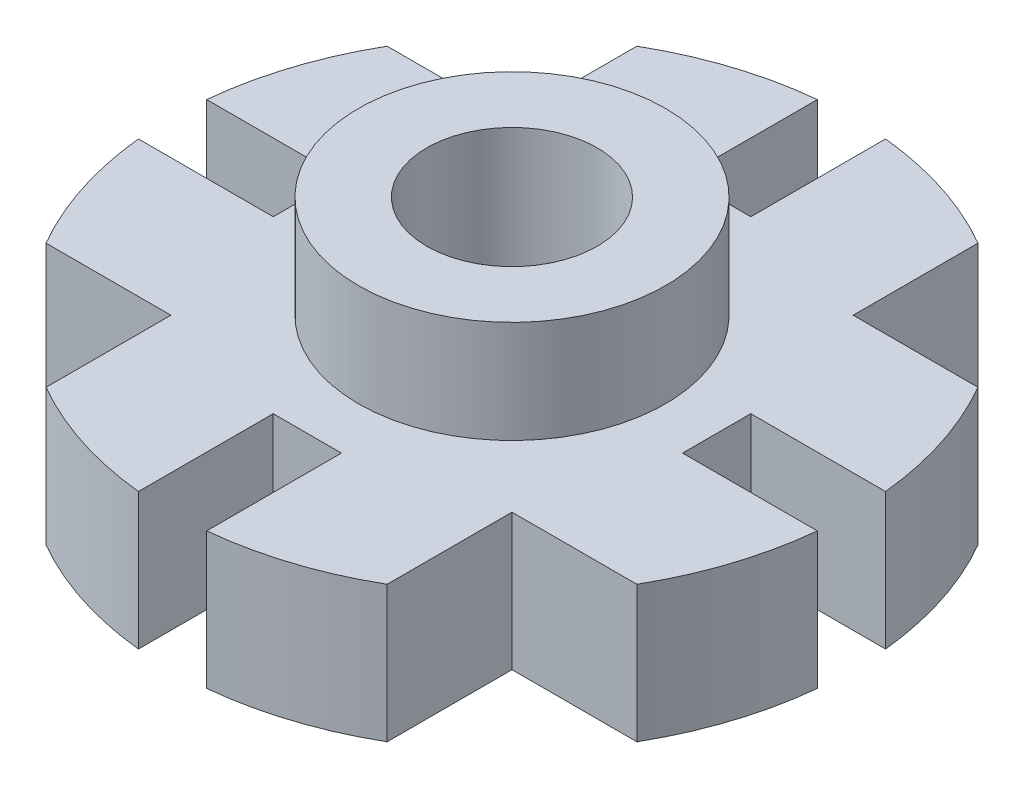
ISO-10303-21;
HEADER;
FILE_DESCRIPTION(('STEP AP214'),'2;1');
FILE_NAME('part.step','',(''),(''),'','','');
FILE_SCHEMA(('AUTOMOTIVE_DESIGN { 1 0 10303 214 1 1 1 1 }'));
ENDSEC;
DATA;
#1=APPLICATION_CONTEXT('core data for automotive mechanical design processes');
#2=APPLICATION_PROTOCOL_DEFINITION('international standard','automotive_design',2000,#1);
#3=PRODUCT_CONTEXT('',#1,'mechanical');
#4=PRODUCT('Part','Part','',(#3));
#5=PRODUCT_RELATED_PRODUCT_CATEGORY('part','',(#4));
#6=PRODUCT_DEFINITION_FORMATION('','',#4);
#7=PRODUCT_DEFINITION_CONTEXT('part definition',#1,'design');
#8=PRODUCT_DEFINITION('design','',#6,#7);
#9=PRODUCT_DEFINITION_SHAPE('','',#8);
#10=(LENGTH_UNIT() NAMED_UNIT(*) SI_UNIT(.MILLI.,.METRE.));
#11=(NAMED_UNIT(*) PLANE_ANGLE_UNIT() SI_UNIT($,.RADIAN.));
#12=(NAMED_UNIT(*) SI_UNIT($,.STERADIAN.) SOLID_ANGLE_UNIT());
#13=UNCERTAINTY_MEASURE_WITH_UNIT(LENGTH_MEASURE(1.E-05),#10,'distance_accuracy_value','');
#14=(GEOMETRIC_REPRESENTATION_CONTEXT(3) GLOBAL_UNCERTAINTY_ASSIGNED_CONTEXT((#13)) GLOBAL_UNIT_ASSIGNED_CONTEXT((#10,
#11,#12)) REPRESENTATION_CONTEXT('',''));
#15=CARTESIAN_POINT('',(0.,0.,0.));
#16=DIRECTION('',(0.,0.,1.));
#17=DIRECTION('',(1.,0.,0.));
#18=AXIS2_PLACEMENT_3D('',#15,#16,#17);
#19=CARTESIAN_POINT('',(20.7089403725581,25.4,-32.941168467633));
#20=DIRECTION('',(0.,-1.,0.));
#21=DIRECTION('',(0.,0.,-1.));
#22=AXIS2_PLACEMENT_3D('',#19,#20,#21);
#23=CYLINDRICAL_SURFACE('',#22,63.5);
#24=CARTESIAN_POINT('',(20.7089403725581,25.4,-32.941168467633));
#25=DIRECTION('',(0.,1.,0.));
#26=DIRECTION('',(0.,0.,1.));
#27=AXIS2_PLACEMENT_3D('',#24,#25,#26);
#28=CIRCLE('',#27,63.5);
#29=CARTESIAN_POINT('',(52.4589403725581,25.4,-87.9337816079449));
#30=VERTEX_POINT('',#29);
#31=CARTESIAN_POINT('',(27.0589403725581,25.4,-96.1228707239034));
#32=VERTEX_POINT('',#31);
#33=EDGE_CURVE('E509',#30,#32,#28,.T.);
#34=ORIENTED_EDGE('',*,*,#33,.F.);
#35=DIRECTION('',(0.,-1.,0.));
#36=VECTOR('',#35,1.);
#37=CARTESIAN_POINT('',(52.4589403725581,25.4,-87.9337816079449));
#38=LINE('',#37,#36);
#39=CARTESIAN_POINT('',(52.4589403725581,0.,-87.9337816079449));
#40=VERTEX_POINT('',#39);
#41=EDGE_CURVE('E321',#30,#40,#38,.T.);
#42=ORIENTED_EDGE('',*,*,#41,.T.);
#43=CARTESIAN_POINT('',(20.7089403725581,0.,-32.941168467633));
#44=DIRECTION('',(0.,1.,0.));
#45=DIRECTION('',(0.,0.,1.));
#46=AXIS2_PLACEMENT_3D('',#43,#44,#45);
#47=CIRCLE('',#46,63.5);
#48=CARTESIAN_POINT('',(27.0589403725581,0.,-96.1228707239034));
#49=VERTEX_POINT('',#48);
#50=EDGE_CURVE('E479',#40,#49,#47,.T.);
#51=ORIENTED_EDGE('',*,*,#50,.T.);
#52=DIRECTION('',(0.,1.,0.));
#53=VECTOR('',#52,1.);
#54=CARTESIAN_POINT('',(27.0589403725581,0.,-96.1228707239034));
#55=LINE('',#54,#53);
#56=EDGE_CURVE('E344',#49,#32,#55,.T.);
#57=ORIENTED_EDGE('',*,*,#56,.T.);
#58=EDGE_LOOP('',(#34,#42,#51,#57));
#59=FACE_BOUND('',#58,.T.);
#60=ADVANCED_FACE('F39',(#59),#23,.T.);
#61=CARTESIAN_POINT('',(14.3589403725581,0.,-96.1228707239034));
#62=VERTEX_POINT('',#61);
#63=CARTESIAN_POINT('',(-11.0410596274419,0.,-87.9337816079449));
#64=VERTEX_POINT('',#63);
#65=EDGE_CURVE('E556',#62,#64,#47,.T.);
#66=ORIENTED_EDGE('',*,*,#65,.T.);
#67=DIRECTION('',(0.,-1.,0.));
#68=VECTOR('',#67,1.);
#69=CARTESIAN_POINT('',(-11.0410596274419,25.4,-87.9337816079449));
#70=LINE('',#69,#68);
#71=CARTESIAN_POINT('',(-11.0410596274419,25.4,-87.9337816079449));
#72=VERTEX_POINT('',#71);
#73=EDGE_CURVE('E313',#64,#72,#70,.F.);
#74=ORIENTED_EDGE('',*,*,#73,.T.);
#75=CARTESIAN_POINT('',(14.3589403725581,25.4,-96.1228707239034));
#76=VERTEX_POINT('',#75);
#77=EDGE_CURVE('E507',#76,#72,#28,.T.);
#78=ORIENTED_EDGE('',*,*,#77,.F.);
#79=DIRECTION('',(0.,1.,0.));
#80=VECTOR('',#79,1.);
#81=CARTESIAN_POINT('',(14.3589403725581,0.,-96.1228707239034));
#82=LINE('',#81,#80);
#83=EDGE_CURVE('E375',#62,#76,#82,.T.);
#84=ORIENTED_EDGE('',*,*,#83,.F.);
#85=EDGE_LOOP('',(#66,#74,#78,#84));
#86=FACE_BOUND('',#85,.T.);
#87=ADVANCED_FACE('F555',(#86),#23,.T.);
#88=CARTESIAN_POINT('',(27.0589403725581,0.,30.2405337886374));
#89=VERTEX_POINT('',#88);
#90=CARTESIAN_POINT('',(52.4589403725581,0.,22.0514446726788));
#91=VERTEX_POINT('',#90);
#92=EDGE_CURVE('E473',#89,#91,#47,.T.);
#93=ORIENTED_EDGE('',*,*,#92,.T.);
#94=DIRECTION('',(0.,-1.,0.));
#95=VECTOR('',#94,1.);
#96=CARTESIAN_POINT('',(52.4589403725581,25.4,22.0514446726788));
#97=LINE('',#96,#95);
#98=CARTESIAN_POINT('',(52.4589403725581,25.4,22.0514446726788));
#99=VERTEX_POINT('',#98);
#100=EDGE_CURVE('E305',#91,#99,#97,.F.);
#101=ORIENTED_EDGE('',*,*,#100,.T.);
#102=CARTESIAN_POINT('',(27.0589403725581,25.4,30.2405337886374));
#103=VERTEX_POINT('',#102);
#104=EDGE_CURVE('E467',#103,#99,#28,.T.);
#105=ORIENTED_EDGE('',*,*,#104,.F.);
#106=DIRECTION('',(0.,1.,0.));
#107=VECTOR('',#106,1.);
#108=CARTESIAN_POINT('',(27.0589403725581,0.,30.2405337886374));
#109=LINE('',#108,#107);
#110=EDGE_CURVE('E445',#89,#103,#109,.T.);
#111=ORIENTED_EDGE('',*,*,#110,.F.);
#112=EDGE_LOOP('',(#93,#101,#105,#111));
#113=FACE_BOUND('',#112,.T.);
#114=ADVANCED_FACE('F574',(#113),#23,.T.);
#115=CARTESIAN_POINT('',(-11.0410596274419,25.4,22.0514446726789));
#116=VERTEX_POINT('',#115);
#117=CARTESIAN_POINT('',(14.3589403725581,25.4,30.2405337886374));
#118=VERTEX_POINT('',#117);
#119=EDGE_CURVE('E477',#116,#118,#28,.T.);
#120=ORIENTED_EDGE('',*,*,#119,.F.);
#121=DIRECTION('',(0.,-1.,0.));
#122=VECTOR('',#121,1.);
#123=CARTESIAN_POINT('',(-11.0410596274419,25.4,22.0514446726789));
#124=LINE('',#123,#122);
#125=CARTESIAN_POINT('',(-11.0410596274419,0.,22.0514446726789));
#126=VERTEX_POINT('',#125);
#127=EDGE_CURVE('E483',#116,#126,#124,.T.);
#128=ORIENTED_EDGE('',*,*,#127,.T.);
#129=CARTESIAN_POINT('',(14.3589403725581,0.,30.2405337886374));
#130=VERTEX_POINT('',#129);
#131=EDGE_CURVE('E253',#126,#130,#47,.T.);
#132=ORIENTED_EDGE('',*,*,#131,.T.);
#133=DIRECTION('',(0.,1.,0.));
#134=VECTOR('',#133,1.);
#135=CARTESIAN_POINT('',(14.3589403725581,0.,30.2405337886374));
#136=LINE('',#135,#134);
#137=EDGE_CURVE('E416',#130,#118,#136,.T.);
#138=ORIENTED_EDGE('',*,*,#137,.T.);
#139=EDGE_LOOP('',(#120,#128,#132,#138));
#140=FACE_BOUND('',#139,.T.);
#141=ADVANCED_FACE('F770',(#140),#23,.T.);
#142=CARTESIAN_POINT('',(83.8906426288284,0.,-39.291168467633));
#143=VERTEX_POINT('',#142);
#144=CARTESIAN_POINT('',(75.7015535128699,0.,-64.691168467633));
#145=VERTEX_POINT('',#144);
#146=EDGE_CURVE('E480',#143,#145,#47,.T.);
#147=ORIENTED_EDGE('',*,*,#146,.T.);
#148=DIRECTION('',(0.,-1.,0.));
#149=VECTOR('',#148,1.);
#150=CARTESIAN_POINT('',(75.7015535128699,25.4,-64.691168467633));
#151=LINE('',#150,#149);
#152=CARTESIAN_POINT('',(75.7015535128699,25.4,-64.691168467633));
#153=VERTEX_POINT('',#152);
#154=EDGE_CURVE('E317',#145,#153,#151,.F.);
#155=ORIENTED_EDGE('',*,*,#154,.T.);
#156=CARTESIAN_POINT('',(83.8906426288284,25.4,-39.291168467633));
#157=VERTEX_POINT('',#156);
#158=EDGE_CURVE('E472',#157,#153,#28,.T.);
#159=ORIENTED_EDGE('',*,*,#158,.F.);
#160=DIRECTION('',(0.,1.,0.));
#161=VECTOR('',#160,1.);
#162=CARTESIAN_POINT('',(83.8906426288284,0.,-39.291168467633));
#163=LINE('',#162,#161);
#164=EDGE_CURVE('E354',#143,#157,#163,.T.);
#165=ORIENTED_EDGE('',*,*,#164,.F.);
#166=EDGE_LOOP('',(#147,#155,#159,#165));
#167=FACE_BOUND('',#166,.T.);
#168=ADVANCED_FACE('F530',(#167),#23,.T.);
#169=CARTESIAN_POINT('',(-34.2836727677538,25.4,-64.691168467633));
#170=VERTEX_POINT('',#169);
#171=CARTESIAN_POINT('',(-42.4727618837123,25.4,-39.291168467633));
#172=VERTEX_POINT('',#171);
#173=EDGE_CURVE('E503',#170,#172,#28,.T.);
#174=ORIENTED_EDGE('',*,*,#173,.F.);
#175=DIRECTION('',(0.,-1.,0.));
#176=VECTOR('',#175,1.);
#177=CARTESIAN_POINT('',(-34.2836727677538,25.4,-64.691168467633));
#178=LINE('',#177,#176);
#179=CARTESIAN_POINT('',(-34.2836727677538,0.,-64.691168467633));
#180=VERTEX_POINT('',#179);
#181=EDGE_CURVE('E309',#170,#180,#178,.T.);
#182=ORIENTED_EDGE('',*,*,#181,.T.);
#183=CARTESIAN_POINT('',(-42.4727618837123,0.,-39.291168467633));
#184=VERTEX_POINT('',#183);
#185=EDGE_CURVE('E495',#180,#184,#47,.T.);
#186=ORIENTED_EDGE('',*,*,#185,.T.);
#187=DIRECTION('',(0.,1.,0.));
#188=VECTOR('',#187,1.);
#189=CARTESIAN_POINT('',(-42.4727618837123,0.,-39.291168467633));
#190=LINE('',#189,#188);
#191=EDGE_CURVE('E428',#184,#172,#190,.T.);
#192=ORIENTED_EDGE('',*,*,#191,.T.);
#193=EDGE_LOOP('',(#174,#182,#186,#192));
#194=FACE_BOUND('',#193,.T.);
#195=ADVANCED_FACE('F501',(#194),#23,.T.);
#196=CARTESIAN_POINT('',(75.7015535128699,25.4,-1.19116846763301));
#197=VERTEX_POINT('',#196);
#198=CARTESIAN_POINT('',(83.8906426288284,25.4,-26.591168467633));
#199=VERTEX_POINT('',#198);
#200=EDGE_CURVE('E471',#197,#199,#28,.T.);
#201=ORIENTED_EDGE('',*,*,#200,.F.);
#202=DIRECTION('',(0.,-1.,0.));
#203=VECTOR('',#202,1.);
#204=CARTESIAN_POINT('',(75.7015535128699,25.4,-1.19116846763301));
#205=LINE('',#204,#203);
#206=CARTESIAN_POINT('',(75.7015535128699,0.,-1.19116846763301));
#207=VERTEX_POINT('',#206);
#208=EDGE_CURVE('E301',#197,#207,#205,.T.);
#209=ORIENTED_EDGE('',*,*,#208,.T.);
#210=CARTESIAN_POINT('',(83.8906426288284,0.,-26.591168467633));
#211=VERTEX_POINT('',#210);
#212=EDGE_CURVE('E478',#207,#211,#47,.T.);
#213=ORIENTED_EDGE('',*,*,#212,.T.);
#214=DIRECTION('',(0.,1.,0.));
#215=VECTOR('',#214,1.);
#216=CARTESIAN_POINT('',(83.8906426288284,0.,-26.591168467633));
#217=LINE('',#216,#215);
#218=EDGE_CURVE('E357',#211,#199,#217,.T.);
#219=ORIENTED_EDGE('',*,*,#218,.T.);
#220=EDGE_LOOP('',(#201,#209,#213,#219));
#221=FACE_BOUND('',#220,.T.);
#222=ADVANCED_FACE('F578',(#221),#23,.T.);
#223=CARTESIAN_POINT('',(20.7089403725581,25.4,-32.941168467633));
#224=DIRECTION('',(0.,1.,0.));
#225=DIRECTION('',(0.,0.,1.));
#226=AXIS2_PLACEMENT_3D('',#223,#224,#225);
#227=PLANE('',#226);
#228=CARTESIAN_POINT('',(20.7089403725581,25.4,-32.941168467633));
#229=DIRECTION('',(0.,1.,0.));
#230=DIRECTION('',(0.,0.,1.));
#231=AXIS2_PLACEMENT_3D('',#228,#229,#230);
#232=CIRCLE('',#231,28.575);
#233=CARTESIAN_POINT('',(20.7089403725581,25.4,-61.516168467633));
#234=VERTEX_POINT('',#233);
#235=EDGE_CURVE('E260',#234,#234,#232,.T.);
#236=ORIENTED_EDGE('',*,*,#235,.F.);
#237=EDGE_LOOP('',(#236));
#238=FACE_BOUND('',#237,.T.);
#239=DIRECTION('',(0.,0.,1.));
#240=VECTOR('',#239,1.);
#241=CARTESIAN_POINT('',(52.4589403725581,25.4,-64.691168467633));
#242=LINE('',#241,#240);
#243=CARTESIAN_POINT('',(52.4589403725581,25.4,-64.691168467633));
#244=VERTEX_POINT('',#243);
#245=EDGE_CURVE('E282',#30,#244,#242,.T.);
#246=ORIENTED_EDGE('',*,*,#245,.F.);
#247=ORIENTED_EDGE('',*,*,#33,.T.);
#248=DIRECTION('',(0.,0.,-1.));
#249=VECTOR('',#248,1.);
#250=CARTESIAN_POINT('',(27.0589403725581,25.4,0.));
#251=LINE('',#250,#249);
#252=CARTESIAN_POINT('',(27.0589403725581,25.4,-71.041168467633));
#253=VERTEX_POINT('',#252);
#254=EDGE_CURVE('E367',#253,#32,#251,.T.);
#255=ORIENTED_EDGE('',*,*,#254,.F.);
#256=DIRECTION('',(1.,0.,0.));
#257=VECTOR('',#256,1.);
#258=CARTESIAN_POINT('',(0.,25.4,-71.041168467633));
#259=LINE('',#258,#257);
#260=CARTESIAN_POINT('',(14.3589403725581,25.4,-71.041168467633));
#261=VERTEX_POINT('',#260);
#262=EDGE_CURVE('E380',#261,#253,#259,.T.);
#263=ORIENTED_EDGE('',*,*,#262,.F.);
#264=DIRECTION('',(0.,0.,-1.));
#265=VECTOR('',#264,1.);
#266=CARTESIAN_POINT('',(14.3589403725581,25.4,0.));
#267=LINE('',#266,#265);
#268=EDGE_CURVE('E376',#261,#76,#267,.T.);
#269=ORIENTED_EDGE('',*,*,#268,.T.);
#270=ORIENTED_EDGE('',*,*,#77,.T.);
#271=DIRECTION('',(0.,0.,-1.));
#272=VECTOR('',#271,1.);
#273=CARTESIAN_POINT('',(-11.0410596274419,25.4,-64.691168467633));
#274=LINE('',#273,#272);
#275=CARTESIAN_POINT('',(-11.0410596274419,25.4,-64.691168467633));
#276=VERTEX_POINT('',#275);
#277=EDGE_CURVE('E269',#276,#72,#274,.T.);
#278=ORIENTED_EDGE('',*,*,#277,.F.);
#279=DIRECTION('',(1.,0.,0.));
#280=VECTOR('',#279,1.);
#281=CARTESIAN_POINT('',(-11.0410596274419,25.4,-64.691168467633));
#282=LINE('',#281,#280);
#283=EDGE_CURVE('E268',#170,#276,#282,.T.);
#284=ORIENTED_EDGE('',*,*,#283,.F.);
#285=ORIENTED_EDGE('',*,*,#173,.T.);
#286=DIRECTION('',(1.,0.,0.));
#287=VECTOR('',#286,1.);
#288=CARTESIAN_POINT('',(0.,25.4,-39.291168467633));
#289=LINE('',#288,#287);
#290=CARTESIAN_POINT('',(-17.3910596274419,25.4,-39.291168467633));
#291=VERTEX_POINT('',#290);
#292=EDGE_CURVE('E415',#172,#291,#289,.T.);
#293=ORIENTED_EDGE('',*,*,#292,.T.);
#294=DIRECTION('',(0.,0.,1.));
#295=VECTOR('',#294,1.);
#296=CARTESIAN_POINT('',(-17.3910596274419,25.4,0.));
#297=LINE('',#296,#295);
#298=CARTESIAN_POINT('',(-17.3910596274419,25.4,-26.591168467633));
#299=VERTEX_POINT('',#298);
#300=EDGE_CURVE('E411',#291,#299,#297,.T.);
#301=ORIENTED_EDGE('',*,*,#300,.T.);
#302=DIRECTION('',(1.,0.,0.));
#303=VECTOR('',#302,1.);
#304=CARTESIAN_POINT('',(0.,25.4,-26.591168467633));
#305=LINE('',#304,#303);
#306=CARTESIAN_POINT('',(-42.4727618837123,25.4,-26.591168467633));
#307=VERTEX_POINT('',#306);
#308=EDGE_CURVE('E403',#307,#299,#305,.T.);
#309=ORIENTED_EDGE('',*,*,#308,.F.);
#310=CARTESIAN_POINT('',(-34.2836727677538,25.4,-1.19116846763301));
#311=VERTEX_POINT('',#310);
#312=EDGE_CURVE('E508',#307,#311,#28,.T.);
#313=ORIENTED_EDGE('',*,*,#312,.T.);
#314=DIRECTION('',(-1.,0.,0.));
#315=VECTOR('',#314,1.);
#316=CARTESIAN_POINT('',(-11.0410596274419,25.4,-1.19116846763301));
#317=LINE('',#316,#315);
#318=CARTESIAN_POINT('',(-11.0410596274419,25.4,-1.19116846763301));
#319=VERTEX_POINT('',#318);
#320=EDGE_CURVE('E255',#319,#311,#317,.T.);
#321=ORIENTED_EDGE('',*,*,#320,.F.);
#322=DIRECTION('',(0.,0.,-1.));
#323=VECTOR('',#322,1.);
#324=CARTESIAN_POINT('',(-11.0410596274419,25.4,-1.19116846763301));
#325=LINE('',#324,#323);
#326=EDGE_CURVE('E233',#116,#319,#325,.T.);
#327=ORIENTED_EDGE('',*,*,#326,.F.);
#328=ORIENTED_EDGE('',*,*,#119,.T.);
#329=DIRECTION('',(0.,0.,1.));
#330=VECTOR('',#329,1.);
#331=CARTESIAN_POINT('',(14.3589403725581,25.4,0.));
#332=LINE('',#331,#330);
#333=CARTESIAN_POINT('',(14.3589403725581,25.4,5.15883153236699));
#334=VERTEX_POINT('',#333);
#335=EDGE_CURVE('E438',#334,#118,#332,.T.);
#336=ORIENTED_EDGE('',*,*,#335,.F.);
#337=DIRECTION('',(1.,0.,0.));
#338=VECTOR('',#337,1.);
#339=CARTESIAN_POINT('',(0.,25.4,5.15883153236699));
#340=LINE('',#339,#338);
#341=CARTESIAN_POINT('',(27.0589403725581,25.4,5.15883153236699));
#342=VERTEX_POINT('',#341);
#343=EDGE_CURVE('E449',#334,#342,#340,.T.);
#344=ORIENTED_EDGE('',*,*,#343,.T.);
#345=DIRECTION('',(0.,0.,1.));
#346=VECTOR('',#345,1.);
#347=CARTESIAN_POINT('',(27.0589403725581,25.4,0.));
#348=LINE('',#347,#346);
#349=EDGE_CURVE('E325',#342,#103,#348,.T.);
#350=ORIENTED_EDGE('',*,*,#349,.T.);
#351=ORIENTED_EDGE('',*,*,#104,.T.);
#352=DIRECTION('',(0.,0.,1.));
#353=VECTOR('',#352,1.);
#354=CARTESIAN_POINT('',(52.4589403725581,25.4,-1.19116846763301));
#355=LINE('',#354,#353);
#356=CARTESIAN_POINT('',(52.4589403725581,25.4,-1.19116846763301));
#357=VERTEX_POINT('',#356);
#358=EDGE_CURVE('E237',#357,#99,#355,.T.);
#359=ORIENTED_EDGE('',*,*,#358,.F.);
#360=DIRECTION('',(-1.,0.,0.));
#361=VECTOR('',#360,1.);
#362=CARTESIAN_POINT('',(52.4589403725581,25.4,-1.19116846763301));
#363=LINE('',#362,#361);
#364=EDGE_CURVE('E294',#197,#357,#363,.T.);
#365=ORIENTED_EDGE('',*,*,#364,.F.);
#366=ORIENTED_EDGE('',*,*,#200,.T.);
#367=DIRECTION('',(1.,0.,0.));
#368=VECTOR('',#367,1.);
#369=CARTESIAN_POINT('',(0.,25.4,-26.591168467633));
#370=LINE('',#369,#368);
#371=CARTESIAN_POINT('',(58.8089403725581,25.4,-26.591168467633));
#372=VERTEX_POINT('',#371);
#373=EDGE_CURVE('E343',#372,#199,#370,.T.);
#374=ORIENTED_EDGE('',*,*,#373,.F.);
#375=DIRECTION('',(0.,0.,1.));
#376=VECTOR('',#375,1.);
#377=CARTESIAN_POINT('',(58.8089403725581,25.4,0.));
#378=LINE('',#377,#376);
#379=CARTESIAN_POINT('',(58.8089403725581,25.4,-39.291168467633));
#380=VERTEX_POINT('',#379);
#381=EDGE_CURVE('E339',#380,#372,#378,.T.);
#382=ORIENTED_EDGE('',*,*,#381,.F.);
#383=DIRECTION('',(1.,0.,0.));
#384=VECTOR('',#383,1.);
#385=CARTESIAN_POINT('',(0.,25.4,-39.291168467633));
#386=LINE('',#385,#384);
#387=EDGE_CURVE('E331',#380,#157,#386,.T.);
#388=ORIENTED_EDGE('',*,*,#387,.T.);
#389=ORIENTED_EDGE('',*,*,#158,.T.);
#390=DIRECTION('',(1.,0.,0.));
#391=VECTOR('',#390,1.);
#392=CARTESIAN_POINT('',(52.4589403725581,25.4,-64.691168467633));
#393=LINE('',#392,#391);
#394=EDGE_CURVE('E281',#244,#153,#393,.T.);
#395=ORIENTED_EDGE('',*,*,#394,.F.);
#396=EDGE_LOOP('',(#246,#247,#255,#263,#269,#270,#278,#284,#285,#293,#301,#309,#313,#321,#327,
#328,#336,#344,#350,#351,#359,#365,#366,#374,#382,#388,#389,#395));
#397=FACE_BOUND('',#396,.T.);
#398=ADVANCED_FACE('F524',(#238,#397),#227,.T.);
#399=CARTESIAN_POINT('',(20.7089403725581,0.,-32.941168467633));
#400=DIRECTION('',(0.,1.,0.));
#401=DIRECTION('',(0.,0.,1.));
#402=AXIS2_PLACEMENT_3D('',#399,#400,#401);
#403=PLANE('',#402);
#404=CARTESIAN_POINT('',(20.7089403725581,0.,-32.941168467633));
#405=DIRECTION('',(0.,1.,0.));
#406=DIRECTION('',(0.,0.,1.));
#407=AXIS2_PLACEMENT_3D('',#404,#405,#406);
#408=CIRCLE('',#407,15.875);
#409=CARTESIAN_POINT('',(20.7089403725581,0.,-17.066168467633));
#410=VERTEX_POINT('',#409);
#411=EDGE_CURVE('E682',#410,#410,#408,.T.);
#412=ORIENTED_EDGE('',*,*,#411,.T.);
#413=EDGE_LOOP('',(#412));
#414=FACE_BOUND('',#413,.T.);
#415=ORIENTED_EDGE('',*,*,#50,.F.);
#416=DIRECTION('',(0.,0.,1.));
#417=VECTOR('',#416,1.);
#418=CARTESIAN_POINT('',(52.4589403725581,0.,-32.941168467633));
#419=LINE('',#418,#417);
#420=CARTESIAN_POINT('',(52.4589403725581,0.,-64.691168467633));
#421=VERTEX_POINT('',#420);
#422=EDGE_CURVE('E11',#40,#421,#419,.T.);
#423=ORIENTED_EDGE('',*,*,#422,.T.);
#424=DIRECTION('',(1.,0.,0.));
#425=VECTOR('',#424,1.);
#426=CARTESIAN_POINT('',(52.4589403725581,0.,-64.691168467633));
#427=LINE('',#426,#425);
#428=EDGE_CURVE('E277',#421,#145,#427,.T.);
#429=ORIENTED_EDGE('',*,*,#428,.T.);
#430=ORIENTED_EDGE('',*,*,#146,.F.);
#431=DIRECTION('',(1.,0.,0.));
#432=VECTOR('',#431,1.);
#433=CARTESIAN_POINT('',(0.,0.,-39.291168467633));
#434=LINE('',#433,#432);
#435=CARTESIAN_POINT('',(58.8089403725581,0.,-39.291168467633));
#436=VERTEX_POINT('',#435);
#437=EDGE_CURVE('E335',#436,#143,#434,.T.);
#438=ORIENTED_EDGE('',*,*,#437,.F.);
#439=DIRECTION('',(0.,0.,1.));
#440=VECTOR('',#439,1.);
#441=CARTESIAN_POINT('',(58.8089403725581,0.,0.));
#442=LINE('',#441,#440);
#443=CARTESIAN_POINT('',(58.8089403725581,0.,-26.591168467633));
#444=VERTEX_POINT('',#443);
#445=EDGE_CURVE('E326',#436,#444,#442,.T.);
#446=ORIENTED_EDGE('',*,*,#445,.T.);
#447=DIRECTION('',(1.,0.,0.));
#448=VECTOR('',#447,1.);
#449=CARTESIAN_POINT('',(0.,0.,-26.591168467633));
#450=LINE('',#449,#448);
#451=EDGE_CURVE('E330',#444,#211,#450,.T.);
#452=ORIENTED_EDGE('',*,*,#451,.T.);
#453=ORIENTED_EDGE('',*,*,#212,.F.);
#454=DIRECTION('',(-1.,0.,0.));
#455=VECTOR('',#454,1.);
#456=CARTESIAN_POINT('',(20.7089403725581,0.,-1.19116846763301));
#457=LINE('',#456,#455);
#458=CARTESIAN_POINT('',(52.4589403725581,0.,-1.19116846763301));
#459=VERTEX_POINT('',#458);
#460=EDGE_CURVE('E486',#207,#459,#457,.T.);
#461=ORIENTED_EDGE('',*,*,#460,.T.);
#462=DIRECTION('',(0.,0.,1.));
#463=VECTOR('',#462,1.);
#464=CARTESIAN_POINT('',(52.4589403725581,0.,-1.19116846763301));
#465=LINE('',#464,#463);
#466=EDGE_CURVE('E63',#459,#91,#465,.T.);
#467=ORIENTED_EDGE('',*,*,#466,.T.);
#468=ORIENTED_EDGE('',*,*,#92,.F.);
#469=DIRECTION('',(0.,0.,1.));
#470=VECTOR('',#469,1.);
#471=CARTESIAN_POINT('',(27.0589403725581,0.,0.));
#472=LINE('',#471,#470);
#473=CARTESIAN_POINT('',(27.0589403725581,0.,5.15883153236699));
#474=VERTEX_POINT('',#473);
#475=EDGE_CURVE('E434',#474,#89,#472,.T.);
#476=ORIENTED_EDGE('',*,*,#475,.F.);
#477=DIRECTION('',(1.,0.,0.));
#478=VECTOR('',#477,1.);
#479=CARTESIAN_POINT('',(0.,0.,5.15883153236699));
#480=LINE('',#479,#478);
#481=CARTESIAN_POINT('',(14.3589403725581,0.,5.15883153236699));
#482=VERTEX_POINT('',#481);
#483=EDGE_CURVE('E437',#482,#474,#480,.T.);
#484=ORIENTED_EDGE('',*,*,#483,.F.);
#485=DIRECTION('',(0.,0.,1.));
#486=VECTOR('',#485,1.);
#487=CARTESIAN_POINT('',(14.3589403725581,0.,0.));
#488=LINE('',#487,#486);
#489=EDGE_CURVE('E442',#482,#130,#488,.T.);
#490=ORIENTED_EDGE('',*,*,#489,.T.);
#491=ORIENTED_EDGE('',*,*,#131,.F.);
#492=DIRECTION('',(0.,0.,-1.));
#493=VECTOR('',#492,1.);
#494=CARTESIAN_POINT('',(-11.0410596274419,0.,-1.19116846763301));
#495=LINE('',#494,#493);
#496=CARTESIAN_POINT('',(-11.0410596274419,0.,-1.19116846763301));
#497=VERTEX_POINT('',#496);
#498=EDGE_CURVE('E230',#126,#497,#495,.T.);
#499=ORIENTED_EDGE('',*,*,#498,.T.);
#500=DIRECTION('',(-1.,0.,0.));
#501=VECTOR('',#500,1.);
#502=CARTESIAN_POINT('',(-11.0410596274419,0.,-1.19116846763301));
#503=LINE('',#502,#501);
#504=CARTESIAN_POINT('',(-34.2836727677538,0.,-1.19116846763301));
#505=VERTEX_POINT('',#504);
#506=EDGE_CURVE('E238',#497,#505,#503,.T.);
#507=ORIENTED_EDGE('',*,*,#506,.T.);
#508=CARTESIAN_POINT('',(-42.4727618837123,0.,-26.591168467633));
#509=VERTEX_POINT('',#508);
#510=EDGE_CURVE('E873',#509,#505,#47,.T.);
#511=ORIENTED_EDGE('',*,*,#510,.F.);
#512=DIRECTION('',(1.,0.,0.));
#513=VECTOR('',#512,1.);
#514=CARTESIAN_POINT('',(0.,0.,-26.591168467633));
#515=LINE('',#514,#513);
#516=CARTESIAN_POINT('',(-17.3910596274419,0.,-26.591168467633));
#517=VERTEX_POINT('',#516);
#518=EDGE_CURVE('E406',#509,#517,#515,.T.);
#519=ORIENTED_EDGE('',*,*,#518,.T.);
#520=DIRECTION('',(0.,0.,1.));
#521=VECTOR('',#520,1.);
#522=CARTESIAN_POINT('',(-17.3910596274419,0.,0.));
#523=LINE('',#522,#521);
#524=CARTESIAN_POINT('',(-17.3910596274419,0.,-39.291168467633));
#525=VERTEX_POINT('',#524);
#526=EDGE_CURVE('E399',#525,#517,#523,.T.);
#527=ORIENTED_EDGE('',*,*,#526,.F.);
#528=DIRECTION('',(1.,0.,0.));
#529=VECTOR('',#528,1.);
#530=CARTESIAN_POINT('',(0.,0.,-39.291168467633));
#531=LINE('',#530,#529);
#532=EDGE_CURVE('E402',#184,#525,#531,.T.);
#533=ORIENTED_EDGE('',*,*,#532,.F.);
#534=ORIENTED_EDGE('',*,*,#185,.F.);
#535=DIRECTION('',(1.,0.,0.));
#536=VECTOR('',#535,1.);
#537=CARTESIAN_POINT('',(20.7089403725581,0.,-64.691168467633));
#538=LINE('',#537,#536);
#539=CARTESIAN_POINT('',(-11.0410596274419,0.,-64.691168467633));
#540=VERTEX_POINT('',#539);
#541=EDGE_CURVE('E48',#180,#540,#538,.T.);
#542=ORIENTED_EDGE('',*,*,#541,.T.);
#543=DIRECTION('',(0.,0.,-1.));
#544=VECTOR('',#543,1.);
#545=CARTESIAN_POINT('',(-11.0410596274419,0.,-64.691168467633));
#546=LINE('',#545,#544);
#547=EDGE_CURVE('E55',#540,#64,#546,.T.);
#548=ORIENTED_EDGE('',*,*,#547,.T.);
#549=ORIENTED_EDGE('',*,*,#65,.F.);
#550=DIRECTION('',(0.,0.,-1.));
#551=VECTOR('',#550,1.);
#552=CARTESIAN_POINT('',(14.3589403725581,0.,0.));
#553=LINE('',#552,#551);
#554=CARTESIAN_POINT('',(14.3589403725581,0.,-71.041168467633));
#555=VERTEX_POINT('',#554);
#556=EDGE_CURVE('E363',#555,#62,#553,.T.);
#557=ORIENTED_EDGE('',*,*,#556,.F.);
#558=DIRECTION('',(1.,0.,0.));
#559=VECTOR('',#558,1.);
#560=CARTESIAN_POINT('',(0.,0.,-71.041168467633));
#561=LINE('',#560,#559);
#562=CARTESIAN_POINT('',(27.0589403725581,0.,-71.041168467633));
#563=VERTEX_POINT('',#562);
#564=EDGE_CURVE('E366',#555,#563,#561,.T.);
#565=ORIENTED_EDGE('',*,*,#564,.T.);
#566=DIRECTION('',(0.,0.,-1.));
#567=VECTOR('',#566,1.);
#568=CARTESIAN_POINT('',(27.0589403725581,0.,0.));
#569=LINE('',#568,#567);
#570=EDGE_CURVE('E371',#563,#49,#569,.T.);
#571=ORIENTED_EDGE('',*,*,#570,.T.);
#572=EDGE_LOOP('',(#415,#423,#429,#430,#438,#446,#452,#453,#461,#467,#468,#476,#484,#490,#491,
#499,#507,#511,#519,#527,#533,#534,#542,#548,#549,#557,#565,#571));
#573=FACE_BOUND('',#572,.T.);
#574=ADVANCED_FACE('F251',(#414,#573),#403,.F.);
#575=ORIENTED_EDGE('',*,*,#510,.T.);
#576=DIRECTION('',(0.,-1.,0.));
#577=VECTOR('',#576,1.);
#578=CARTESIAN_POINT('',(-34.2836727677538,25.4,-1.19116846763301));
#579=LINE('',#578,#577);
#580=EDGE_CURVE('E243',#505,#311,#579,.F.);
#581=ORIENTED_EDGE('',*,*,#580,.T.);
#582=ORIENTED_EDGE('',*,*,#312,.F.);
#583=DIRECTION('',(0.,1.,0.));
#584=VECTOR('',#583,1.);
#585=CARTESIAN_POINT('',(-42.4727618837123,0.,-26.591168467633));
#586=LINE('',#585,#584);
#587=EDGE_CURVE('E425',#509,#307,#586,.T.);
#588=ORIENTED_EDGE('',*,*,#587,.F.);
#589=EDGE_LOOP('',(#575,#581,#582,#588));
#590=FACE_BOUND('',#589,.T.);
#591=ADVANCED_FACE('F41',(#590),#23,.T.);
#592=CARTESIAN_POINT('',(14.3589403725581,0.,0.));
#593=DIRECTION('',(-1.,0.,0.));
#594=DIRECTION('',(0.,0.,1.));
#595=AXIS2_PLACEMENT_3D('',#592,#593,#594);
#596=PLANE('',#595);
#597=ORIENTED_EDGE('',*,*,#335,.T.);
#598=ORIENTED_EDGE('',*,*,#137,.F.);
#599=ORIENTED_EDGE('',*,*,#489,.F.);
#600=DIRECTION('',(0.,1.,0.));
#601=VECTOR('',#600,1.);
#602=CARTESIAN_POINT('',(14.3589403725581,0.,5.15883153236699));
#603=LINE('',#602,#601);
#604=EDGE_CURVE('E459',#482,#334,#603,.T.);
#605=ORIENTED_EDGE('',*,*,#604,.T.);
#606=EDGE_LOOP('',(#597,#598,#599,#605));
#607=FACE_BOUND('',#606,.T.);
#608=ADVANCED_FACE('F576',(#607),#596,.F.);
#609=CARTESIAN_POINT('',(0.,0.,5.15883153236699));
#610=DIRECTION('',(0.,0.,1.));
#611=DIRECTION('',(1.,0.,0.));
#612=AXIS2_PLACEMENT_3D('',#609,#610,#611);
#613=PLANE('',#612);
#614=ORIENTED_EDGE('',*,*,#343,.F.);
#615=ORIENTED_EDGE('',*,*,#604,.F.);
#616=ORIENTED_EDGE('',*,*,#483,.T.);
#617=DIRECTION('',(0.,1.,0.));
#618=VECTOR('',#617,1.);
#619=CARTESIAN_POINT('',(27.0589403725581,0.,5.15883153236699));
#620=LINE('',#619,#618);
#621=EDGE_CURVE('E462',#474,#342,#620,.T.);
#622=ORIENTED_EDGE('',*,*,#621,.T.);
#623=EDGE_LOOP('',(#614,#615,#616,#622));
#624=FACE_BOUND('',#623,.T.);
#625=ADVANCED_FACE('F583',(#624),#613,.T.);
#626=CARTESIAN_POINT('',(27.0589403725581,0.,0.));
#627=DIRECTION('',(-1.,0.,0.));
#628=DIRECTION('',(0.,0.,1.));
#629=AXIS2_PLACEMENT_3D('',#626,#627,#628);
#630=PLANE('',#629);
#631=ORIENTED_EDGE('',*,*,#349,.F.);
#632=ORIENTED_EDGE('',*,*,#621,.F.);
#633=ORIENTED_EDGE('',*,*,#475,.T.);
#634=ORIENTED_EDGE('',*,*,#110,.T.);
#635=EDGE_LOOP('',(#631,#632,#633,#634));
#636=FACE_BOUND('',#635,.T.);
#637=ADVANCED_FACE('F632',(#636),#630,.T.);
#638=CARTESIAN_POINT('',(-17.3910596274419,0.,0.));
#639=DIRECTION('',(-1.,0.,0.));
#640=DIRECTION('',(0.,0.,1.));
#641=AXIS2_PLACEMENT_3D('',#638,#639,#640);
#642=PLANE('',#641);
#643=ORIENTED_EDGE('',*,*,#300,.F.);
#644=DIRECTION('',(0.,1.,0.));
#645=VECTOR('',#644,1.);
#646=CARTESIAN_POINT('',(-17.3910596274419,0.,-39.291168467633));
#647=LINE('',#646,#645);
#648=EDGE_CURVE('E410',#525,#291,#647,.T.);
#649=ORIENTED_EDGE('',*,*,#648,.F.);
#650=ORIENTED_EDGE('',*,*,#526,.T.);
#651=DIRECTION('',(0.,1.,0.));
#652=VECTOR('',#651,1.);
#653=CARTESIAN_POINT('',(-17.3910596274419,0.,-26.591168467633));
#654=LINE('',#653,#652);
#655=EDGE_CURVE('E381',#517,#299,#654,.T.);
#656=ORIENTED_EDGE('',*,*,#655,.T.);
#657=EDGE_LOOP('',(#643,#649,#650,#656));
#658=FACE_BOUND('',#657,.T.);
#659=ADVANCED_FACE('F626',(#658),#642,.T.);
#660=CARTESIAN_POINT('',(0.,0.,-26.591168467633));
#661=DIRECTION('',(0.,0.,1.));
#662=DIRECTION('',(1.,0.,0.));
#663=AXIS2_PLACEMENT_3D('',#660,#661,#662);
#664=PLANE('',#663);
#665=ORIENTED_EDGE('',*,*,#308,.T.);
#666=ORIENTED_EDGE('',*,*,#655,.F.);
#667=ORIENTED_EDGE('',*,*,#518,.F.);
#668=ORIENTED_EDGE('',*,*,#587,.T.);
#669=EDGE_LOOP('',(#665,#666,#667,#668));
#670=FACE_BOUND('',#669,.T.);
#671=ADVANCED_FACE('F623',(#670),#664,.F.);
#672=CARTESIAN_POINT('',(0.,0.,-39.291168467633));
#673=DIRECTION('',(0.,0.,1.));
#674=DIRECTION('',(1.,0.,0.));
#675=AXIS2_PLACEMENT_3D('',#672,#673,#674);
#676=PLANE('',#675);
#677=ORIENTED_EDGE('',*,*,#292,.F.);
#678=ORIENTED_EDGE('',*,*,#191,.F.);
#679=ORIENTED_EDGE('',*,*,#532,.T.);
#680=ORIENTED_EDGE('',*,*,#648,.T.);
#681=EDGE_LOOP('',(#677,#678,#679,#680));
#682=FACE_BOUND('',#681,.T.);
#683=ADVANCED_FACE('F618',(#682),#676,.T.);
#684=CARTESIAN_POINT('',(27.0589403725581,0.,0.));
#685=DIRECTION('',(1.,0.,0.));
#686=DIRECTION('',(0.,0.,-1.));
#687=AXIS2_PLACEMENT_3D('',#684,#685,#686);
#688=PLANE('',#687);
#689=ORIENTED_EDGE('',*,*,#254,.T.);
#690=ORIENTED_EDGE('',*,*,#56,.F.);
#691=ORIENTED_EDGE('',*,*,#570,.F.);
#692=DIRECTION('',(0.,1.,0.));
#693=VECTOR('',#692,1.);
#694=CARTESIAN_POINT('',(27.0589403725581,0.,-71.041168467633));
#695=LINE('',#694,#693);
#696=EDGE_CURVE('E391',#563,#253,#695,.T.);
#697=ORIENTED_EDGE('',*,*,#696,.T.);
#698=EDGE_LOOP('',(#689,#690,#691,#697));
#699=FACE_BOUND('',#698,.T.);
#700=ADVANCED_FACE('F544',(#699),#688,.F.);
#701=CARTESIAN_POINT('',(0.,0.,-71.041168467633));
#702=DIRECTION('',(0.,0.,1.));
#703=DIRECTION('',(1.,0.,0.));
#704=AXIS2_PLACEMENT_3D('',#701,#702,#703);
#705=PLANE('',#704);
#706=ORIENTED_EDGE('',*,*,#262,.T.);
#707=ORIENTED_EDGE('',*,*,#696,.F.);
#708=ORIENTED_EDGE('',*,*,#564,.F.);
#709=DIRECTION('',(0.,1.,0.));
#710=VECTOR('',#709,1.);
#711=CARTESIAN_POINT('',(14.3589403725581,0.,-71.041168467633));
#712=LINE('',#711,#710);
#713=EDGE_CURVE('E394',#555,#261,#712,.T.);
#714=ORIENTED_EDGE('',*,*,#713,.T.);
#715=EDGE_LOOP('',(#706,#707,#708,#714));
#716=FACE_BOUND('',#715,.T.);
#717=ADVANCED_FACE('F547',(#716),#705,.F.);
#718=CARTESIAN_POINT('',(14.3589403725581,0.,0.));
#719=DIRECTION('',(1.,0.,0.));
#720=DIRECTION('',(0.,0.,-1.));
#721=AXIS2_PLACEMENT_3D('',#718,#719,#720);
#722=PLANE('',#721);
#723=ORIENTED_EDGE('',*,*,#268,.F.);
#724=ORIENTED_EDGE('',*,*,#713,.F.);
#725=ORIENTED_EDGE('',*,*,#556,.T.);
#726=ORIENTED_EDGE('',*,*,#83,.T.);
#727=EDGE_LOOP('',(#723,#724,#725,#726));
#728=FACE_BOUND('',#727,.T.);
#729=ADVANCED_FACE('F612',(#728),#722,.T.);
#730=CARTESIAN_POINT('',(58.8089403725581,0.,0.));
#731=DIRECTION('',(-1.,0.,0.));
#732=DIRECTION('',(0.,0.,1.));
#733=AXIS2_PLACEMENT_3D('',#730,#731,#732);
#734=PLANE('',#733);
#735=ORIENTED_EDGE('',*,*,#381,.T.);
#736=DIRECTION('',(0.,1.,0.));
#737=VECTOR('',#736,1.);
#738=CARTESIAN_POINT('',(58.8089403725581,0.,-26.591168467633));
#739=LINE('',#738,#737);
#740=EDGE_CURVE('E338',#444,#372,#739,.T.);
#741=ORIENTED_EDGE('',*,*,#740,.F.);
#742=ORIENTED_EDGE('',*,*,#445,.F.);
#743=DIRECTION('',(0.,1.,0.));
#744=VECTOR('',#743,1.);
#745=CARTESIAN_POINT('',(58.8089403725581,0.,-39.291168467633));
#746=LINE('',#745,#744);
#747=EDGE_CURVE('E351',#436,#380,#746,.T.);
#748=ORIENTED_EDGE('',*,*,#747,.T.);
#749=EDGE_LOOP('',(#735,#741,#742,#748));
#750=FACE_BOUND('',#749,.T.);
#751=ADVANCED_FACE('F602',(#750),#734,.F.);
#752=CARTESIAN_POINT('',(0.,0.,-39.291168467633));
#753=DIRECTION('',(0.,0.,1.));
#754=DIRECTION('',(1.,0.,0.));
#755=AXIS2_PLACEMENT_3D('',#752,#753,#754);
#756=PLANE('',#755);
#757=ORIENTED_EDGE('',*,*,#387,.F.);
#758=ORIENTED_EDGE('',*,*,#747,.F.);
#759=ORIENTED_EDGE('',*,*,#437,.T.);
#760=ORIENTED_EDGE('',*,*,#164,.T.);
#761=EDGE_LOOP('',(#757,#758,#759,#760));
#762=FACE_BOUND('',#761,.T.);
#763=ADVANCED_FACE('F604',(#762),#756,.T.);
#764=CARTESIAN_POINT('',(0.,0.,-26.591168467633));
#765=DIRECTION('',(0.,0.,1.));
#766=DIRECTION('',(1.,0.,0.));
#767=AXIS2_PLACEMENT_3D('',#764,#765,#766);
#768=PLANE('',#767);
#769=ORIENTED_EDGE('',*,*,#373,.T.);
#770=ORIENTED_EDGE('',*,*,#218,.F.);
#771=ORIENTED_EDGE('',*,*,#451,.F.);
#772=ORIENTED_EDGE('',*,*,#740,.T.);
#773=EDGE_LOOP('',(#769,#770,#771,#772));
#774=FACE_BOUND('',#773,.T.);
#775=ADVANCED_FACE('F599',(#774),#768,.F.);
#776=CARTESIAN_POINT('',(-11.0410596274419,0.,-1.19116846763301));
#777=DIRECTION('',(1.,0.,0.));
#778=DIRECTION('',(0.,0.,-1.));
#779=AXIS2_PLACEMENT_3D('',#776,#777,#778);
#780=PLANE('',#779);
#781=ORIENTED_EDGE('',*,*,#326,.T.);
#782=DIRECTION('',(0.,1.,0.));
#783=VECTOR('',#782,1.);
#784=CARTESIAN_POINT('',(-11.0410596274419,0.,-1.19116846763301));
#785=LINE('',#784,#783);
#786=EDGE_CURVE('E226',#497,#319,#785,.T.);
#787=ORIENTED_EDGE('',*,*,#786,.F.);
#788=ORIENTED_EDGE('',*,*,#498,.F.);
#789=ORIENTED_EDGE('',*,*,#127,.F.);
#790=EDGE_LOOP('',(#781,#787,#788,#789));
#791=FACE_BOUND('',#790,.T.);
#792=ADVANCED_FACE('F228',(#791),#780,.F.);
#793=CARTESIAN_POINT('',(-11.0410596274419,0.,-1.19116846763301));
#794=DIRECTION('',(0.,0.,-1.));
#795=DIRECTION('',(-1.,0.,0.));
#796=AXIS2_PLACEMENT_3D('',#793,#794,#795);
#797=PLANE('',#796);
#798=ORIENTED_EDGE('',*,*,#506,.F.);
#799=ORIENTED_EDGE('',*,*,#786,.T.);
#800=ORIENTED_EDGE('',*,*,#320,.T.);
#801=ORIENTED_EDGE('',*,*,#580,.F.);
#802=EDGE_LOOP('',(#798,#799,#800,#801));
#803=FACE_BOUND('',#802,.T.);
#804=ADVANCED_FACE('F241',(#803),#797,.F.);
#805=CARTESIAN_POINT('',(52.4589403725581,0.,-1.19116846763301));
#806=DIRECTION('',(-1.,0.,0.));
#807=DIRECTION('',(0.,0.,1.));
#808=AXIS2_PLACEMENT_3D('',#805,#806,#807);
#809=PLANE('',#808);
#810=ORIENTED_EDGE('',*,*,#466,.F.);
#811=DIRECTION('',(0.,1.,0.));
#812=VECTOR('',#811,1.);
#813=CARTESIAN_POINT('',(52.4589403725581,0.,-1.19116846763301));
#814=LINE('',#813,#812);
#815=EDGE_CURVE('E293',#459,#357,#814,.T.);
#816=ORIENTED_EDGE('',*,*,#815,.T.);
#817=ORIENTED_EDGE('',*,*,#358,.T.);
#818=ORIENTED_EDGE('',*,*,#100,.F.);
#819=EDGE_LOOP('',(#810,#816,#817,#818));
#820=FACE_BOUND('',#819,.T.);
#821=ADVANCED_FACE('F566',(#820),#809,.F.);
#822=CARTESIAN_POINT('',(52.4589403725581,0.,-1.19116846763301));
#823=DIRECTION('',(0.,0.,-1.));
#824=DIRECTION('',(-1.,0.,0.));
#825=AXIS2_PLACEMENT_3D('',#822,#823,#824);
#826=PLANE('',#825);
#827=ORIENTED_EDGE('',*,*,#364,.T.);
#828=ORIENTED_EDGE('',*,*,#815,.F.);
#829=ORIENTED_EDGE('',*,*,#460,.F.);
#830=ORIENTED_EDGE('',*,*,#208,.F.);
#831=EDGE_LOOP('',(#827,#828,#829,#830));
#832=FACE_BOUND('',#831,.T.);
#833=ADVANCED_FACE('F559',(#832),#826,.F.);
#834=CARTESIAN_POINT('',(-11.0410596274419,0.,-64.691168467633));
#835=DIRECTION('',(1.,0.,0.));
#836=DIRECTION('',(0.,0.,-1.));
#837=AXIS2_PLACEMENT_3D('',#834,#835,#836);
#838=PLANE('',#837);
#839=ORIENTED_EDGE('',*,*,#547,.F.);
#840=DIRECTION('',(0.,1.,0.));
#841=VECTOR('',#840,1.);
#842=CARTESIAN_POINT('',(-11.0410596274419,0.,-64.691168467633));
#843=LINE('',#842,#841);
#844=EDGE_CURVE('E264',#540,#276,#843,.T.);
#845=ORIENTED_EDGE('',*,*,#844,.T.);
#846=ORIENTED_EDGE('',*,*,#277,.T.);
#847=ORIENTED_EDGE('',*,*,#73,.F.);
#848=EDGE_LOOP('',(#839,#845,#846,#847));
#849=FACE_BOUND('',#848,.T.);
#850=ADVANCED_FACE('F557',(#849),#838,.F.);
#851=CARTESIAN_POINT('',(-11.0410596274419,0.,-64.691168467633));
#852=DIRECTION('',(0.,0.,1.));
#853=DIRECTION('',(1.,0.,0.));
#854=AXIS2_PLACEMENT_3D('',#851,#852,#853);
#855=PLANE('',#854);
#856=ORIENTED_EDGE('',*,*,#283,.T.);
#857=ORIENTED_EDGE('',*,*,#844,.F.);
#858=ORIENTED_EDGE('',*,*,#541,.F.);
#859=ORIENTED_EDGE('',*,*,#181,.F.);
#860=EDGE_LOOP('',(#856,#857,#858,#859));
#861=FACE_BOUND('',#860,.T.);
#862=ADVANCED_FACE('F497',(#861),#855,.F.);
#863=CARTESIAN_POINT('',(52.4589403725581,0.,-64.691168467633));
#864=DIRECTION('',(-1.,0.,0.));
#865=DIRECTION('',(0.,0.,1.));
#866=AXIS2_PLACEMENT_3D('',#863,#864,#865);
#867=PLANE('',#866);
#868=ORIENTED_EDGE('',*,*,#245,.T.);
#869=DIRECTION('',(0.,1.,0.));
#870=VECTOR('',#869,1.);
#871=CARTESIAN_POINT('',(52.4589403725581,0.,-64.691168467633));
#872=LINE('',#871,#870);
#873=EDGE_CURVE('E272',#421,#244,#872,.T.);
#874=ORIENTED_EDGE('',*,*,#873,.F.);
#875=ORIENTED_EDGE('',*,*,#422,.F.);
#876=ORIENTED_EDGE('',*,*,#41,.F.);
#877=EDGE_LOOP('',(#868,#874,#875,#876));
#878=FACE_BOUND('',#877,.T.);
#879=ADVANCED_FACE('F537',(#878),#867,.F.);
#880=CARTESIAN_POINT('',(52.4589403725581,0.,-64.691168467633));
#881=DIRECTION('',(0.,0.,1.));
#882=DIRECTION('',(1.,0.,0.));
#883=AXIS2_PLACEMENT_3D('',#880,#881,#882);
#884=PLANE('',#883);
#885=ORIENTED_EDGE('',*,*,#428,.F.);
#886=ORIENTED_EDGE('',*,*,#873,.T.);
#887=ORIENTED_EDGE('',*,*,#394,.T.);
#888=ORIENTED_EDGE('',*,*,#154,.F.);
#889=EDGE_LOOP('',(#885,#886,#887,#888));
#890=FACE_BOUND('',#889,.T.);
#891=ADVANCED_FACE('F534',(#890),#884,.F.);
#892=CARTESIAN_POINT('',(20.7089403725581,44.45,-32.941168467633));
#893=DIRECTION('',(0.,-1.,0.));
#894=DIRECTION('',(0.,0.,-1.));
#895=AXIS2_PLACEMENT_3D('',#892,#893,#894);
#896=CYLINDRICAL_SURFACE('',#895,28.575);
#897=CARTESIAN_POINT('',(20.7089403725581,44.45,-32.941168467633));
#898=DIRECTION('',(0.,1.,0.));
#899=DIRECTION('',(0.,0.,1.));
#900=AXIS2_PLACEMENT_3D('',#897,#898,#899);
#901=CIRCLE('',#900,28.575);
#902=CARTESIAN_POINT('',(20.7089403725581,44.45,-61.516168467633));
#903=VERTEX_POINT('',#902);
#904=EDGE_CURVE('E285',#903,#903,#901,.T.);
#905=CARTESIAN_POINT('',(20.7089403725581,44.45,-61.516168467633));
#906=CARTESIAN_POINT('',(20.7089403725581,44.2515625,-61.516168467633));
#907=CARTESIAN_POINT('',(20.7089403725581,44.053125,-61.516168467633));
#908=CARTESIAN_POINT('',(20.7089403725581,43.65625,-61.516168467633));
#909=CARTESIAN_POINT('',(20.7089403725581,43.4578125,-61.516168467633));
#910=CARTESIAN_POINT('',(20.7089403725581,43.0609375,-61.516168467633));
#911=CARTESIAN_POINT('',(20.7089403725581,42.8625,-61.516168467633));
#912=CARTESIAN_POINT('',(20.7089403725581,42.465625,-61.516168467633));
#913=CARTESIAN_POINT('',(20.7089403725581,42.2671875,-61.516168467633));
#914=CARTESIAN_POINT('',(20.7089403725581,41.8703125,-61.516168467633));
#915=CARTESIAN_POINT('',(20.7089403725581,41.671875,-61.516168467633));
#916=CARTESIAN_POINT('',(20.7089403725581,41.275,-61.516168467633));
#917=CARTESIAN_POINT('',(20.7089403725581,41.0765625,-61.516168467633));
#918=CARTESIAN_POINT('',(20.7089403725581,40.6796875,-61.516168467633));
#919=CARTESIAN_POINT('',(20.7089403725581,40.48125,-61.516168467633));
#920=CARTESIAN_POINT('',(20.7089403725581,40.084375,-61.516168467633));
#921=CARTESIAN_POINT('',(20.7089403725581,39.8859375,-61.516168467633));
#922=CARTESIAN_POINT('',(20.7089403725581,39.4890625,-61.516168467633));
#923=CARTESIAN_POINT('',(20.7089403725581,39.290625,-61.516168467633));
#924=CARTESIAN_POINT('',(20.7089403725581,38.89375,-61.516168467633));
#925=CARTESIAN_POINT('',(20.7089403725581,38.6953125,-61.516168467633));
#926=CARTESIAN_POINT('',(20.7089403725581,38.2984375,-61.516168467633));
#927=CARTESIAN_POINT('',(20.7089403725581,38.1,-61.516168467633));
#928=CARTESIAN_POINT('',(20.7089403725581,37.703125,-61.516168467633));
#929=CARTESIAN_POINT('',(20.7089403725581,37.5046875,-61.516168467633));
#930=CARTESIAN_POINT('',(20.7089403725581,37.1078125,-61.516168467633));
#931=CARTESIAN_POINT('',(20.7089403725581,36.909375,-61.516168467633));
#932=CARTESIAN_POINT('',(20.7089403725581,36.5125,-61.516168467633));
#933=CARTESIAN_POINT('',(20.7089403725581,36.3140625,-61.516168467633));
#934=CARTESIAN_POINT('',(20.7089403725581,35.9171875,-61.516168467633));
#935=CARTESIAN_POINT('',(20.7089403725581,35.71875,-61.516168467633));
#936=CARTESIAN_POINT('',(20.7089403725581,35.321875,-61.516168467633));
#937=CARTESIAN_POINT('',(20.7089403725581,35.1234375,-61.516168467633));
#938=CARTESIAN_POINT('',(20.7089403725581,34.7265625,-61.516168467633));
#939=CARTESIAN_POINT('',(20.7089403725581,34.528125,-61.516168467633));
#940=CARTESIAN_POINT('',(20.7089403725581,34.13125,-61.516168467633));
#941=CARTESIAN_POINT('',(20.7089403725581,33.9328125,-61.516168467633));
#942=CARTESIAN_POINT('',(20.7089403725581,33.5359375,-61.516168467633));
#943=CARTESIAN_POINT('',(20.7089403725581,33.3375,-61.516168467633));
#944=CARTESIAN_POINT('',(20.7089403725581,32.940625,-61.516168467633));
#945=CARTESIAN_POINT('',(20.7089403725581,32.7421875,-61.516168467633));
#946=CARTESIAN_POINT('',(20.7089403725581,32.3453125,-61.516168467633));
#947=CARTESIAN_POINT('',(20.7089403725581,32.146875,-61.516168467633));
#948=CARTESIAN_POINT('',(20.7089403725581,31.75,-61.516168467633));
#949=CARTESIAN_POINT('',(20.7089403725581,31.5515625,-61.516168467633));
#950=CARTESIAN_POINT('',(20.7089403725581,31.1546875,-61.516168467633));
#951=CARTESIAN_POINT('',(20.7089403725581,30.95625,-61.516168467633));
#952=CARTESIAN_POINT('',(20.7089403725581,30.559375,-61.516168467633));
#953=CARTESIAN_POINT('',(20.7089403725581,30.3609375,-61.516168467633));
#954=CARTESIAN_POINT('',(20.7089403725581,29.9640625,-61.516168467633));
#955=CARTESIAN_POINT('',(20.7089403725581,29.765625,-61.516168467633));
#956=CARTESIAN_POINT('',(20.7089403725581,29.36875,-61.516168467633));
#957=CARTESIAN_POINT('',(20.7089403725581,29.1703125,-61.516168467633));
#958=CARTESIAN_POINT('',(20.7089403725581,28.7734375,-61.516168467633));
#959=CARTESIAN_POINT('',(20.7089403725581,28.575,-61.516168467633));
#960=CARTESIAN_POINT('',(20.7089403725581,28.178125,-61.516168467633));
#961=CARTESIAN_POINT('',(20.7089403725581,27.9796875,-61.516168467633));
#962=CARTESIAN_POINT('',(20.7089403725581,27.5828125,-61.516168467633));
#963=CARTESIAN_POINT('',(20.7089403725581,27.384375,-61.516168467633));
#964=CARTESIAN_POINT('',(20.7089403725581,26.9875,-61.516168467633));
#965=CARTESIAN_POINT('',(20.7089403725581,26.7890625,-61.516168467633));
#966=CARTESIAN_POINT('',(20.7089403725581,26.3921875,-61.516168467633));
#967=CARTESIAN_POINT('',(20.7089403725581,26.19375,-61.516168467633));
#968=CARTESIAN_POINT('',(20.7089403725581,25.796875,-61.516168467633));
#969=CARTESIAN_POINT('',(20.7089403725581,25.5984375,-61.516168467633));
#970=CARTESIAN_POINT('',(20.7089403725581,25.4,-61.516168467633));
#971=B_SPLINE_CURVE_WITH_KNOTS('',3,(#905,#906,#907,#908,#909,#910,#911,#912,#913,#914,#915,
#916,#917,#918,#919,#920,#921,#922,#923,#924,#925,#926,#927,#928,#929,#930,#931,#932,#933,#934,
#935,#936,#937,#938,#939,#940,#941,#942,#943,#944,#945,#946,#947,#948,#949,#950,#951,#952,#953,
#954,#955,#956,#957,#958,#959,#960,#961,#962,#963,#964,#965,#966,#967,#968,#969,#970),
.UNSPECIFIED.,.F.,.F.,(4,2,2,2,2,2,2,2,2,2,2,2,2,2,2,2,2,2,2,2,2,2,2,2,2,2,2,2,2,2,2,2,4),(0.,
0.5953125,1.190625,1.7859375,2.38125,2.9765625,3.571875,4.1671875,4.7625,5.3578125,5.953125,
6.5484375,7.14375,7.7390625,8.334375,8.92968750000001,9.52500000000001,10.1203125,10.715625,
11.3109375,11.90625,12.5015625,13.096875,13.6921875,14.2875,14.8828125,15.478125,16.0734375,
16.66875,17.2640625,17.859375,18.4546875,19.05),.UNSPECIFIED.);
#972=EDGE_CURVE('BSEAM663',#903,#234,#971,.T.);
#973=ORIENTED_EDGE('',*,*,#904,.F.);
#974=ORIENTED_EDGE('',*,*,#235,.T.);
#975=ORIENTED_EDGE('',*,*,#972,.T.);
#976=ORIENTED_EDGE('',*,*,#972,.F.);
#977=EDGE_LOOP('',(#973,#975,#974,#976));
#978=FACE_BOUND('',#977,.T.);
#979=ADVANCED_FACE('F663',(#978),#896,.T.);
#980=CARTESIAN_POINT('',(20.7089403725581,44.45,-32.941168467633));
#981=DIRECTION('',(0.,1.,0.));
#982=DIRECTION('',(0.,0.,1.));
#983=AXIS2_PLACEMENT_3D('',#980,#981,#982);
#984=PLANE('',#983);
#985=CARTESIAN_POINT('',(20.7089403725581,44.45,-32.941168467633));
#986=DIRECTION('',(0.,1.,0.));
#987=DIRECTION('',(0.,0.,1.));
#988=AXIS2_PLACEMENT_3D('',#985,#986,#987);
#989=CIRCLE('',#988,15.875);
#990=CARTESIAN_POINT('',(20.7089403725581,44.45,-17.066168467633));
#991=VERTEX_POINT('',#990);
#992=EDGE_CURVE('E679',#991,#991,#989,.T.);
#993=ORIENTED_EDGE('',*,*,#992,.F.);
#994=EDGE_LOOP('',(#993));
#995=FACE_BOUND('',#994,.T.);
#996=ORIENTED_EDGE('',*,*,#904,.T.);
#997=EDGE_LOOP('',(#996));
#998=FACE_BOUND('',#997,.T.);
#999=ADVANCED_FACE('F666',(#995,#998),#984,.T.);
#1000=CARTESIAN_POINT('',(20.7089403725581,-28.194,-32.941168467633));
#1001=DIRECTION('',(0.,1.,0.));
#1002=DIRECTION('',(0.,0.,1.));
#1003=AXIS2_PLACEMENT_3D('',#1000,#1001,#1002);
#1004=CYLINDRICAL_SURFACE('',#1003,15.875);
#1005=ORIENTED_EDGE('',*,*,#992,.T.);
#1006=EDGE_LOOP('',(#1005));
#1007=FACE_BOUND('',#1006,.T.);
#1008=ORIENTED_EDGE('',*,*,#411,.F.);
#1009=EDGE_LOOP('',(#1008));
#1010=FACE_BOUND('',#1009,.T.);
#1011=ADVANCED_FACE('F670',(#1007,#1010),#1004,.F.);
#1012=CLOSED_SHELL('',(#60,#87,#114,#141,#168,#195,#222,#398,#574,#591,#608,#625,#637,#659,#671,
#683,#700,#717,#729,#751,#763,#775,#792,#804,#821,#833,#850,#862,#879,#891,#979,#999,#1011));
#1013=MANIFOLD_SOLID_BREP('B2',#1012);
#1014=ADVANCED_BREP_SHAPE_REPRESENTATION('',(#18,#1013),#14);
#1015=SHAPE_DEFINITION_REPRESENTATION(#9,#1014);
ENDSEC;
END-ISO-10303-21;
